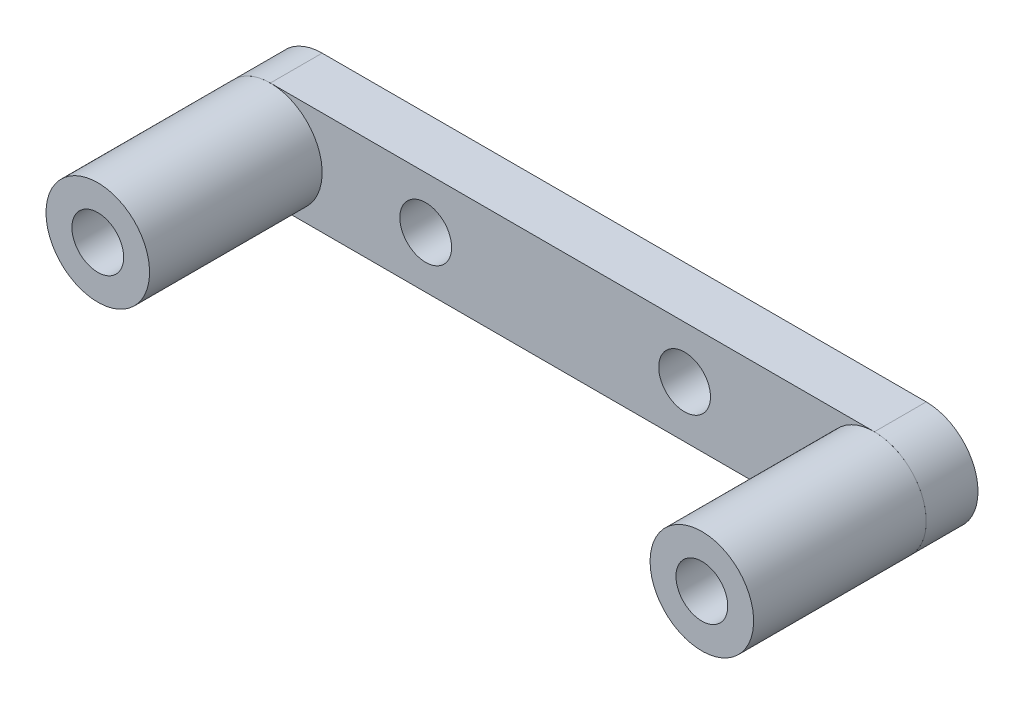
ISO-10303-21;
HEADER;
FILE_DESCRIPTION(('STEP AP214'),'2;1');
FILE_NAME('part.step','',(''),(''),'','','');
FILE_SCHEMA(('AUTOMOTIVE_DESIGN { 1 0 10303 214 1 1 1 1 }'));
ENDSEC;
DATA;
#1=APPLICATION_CONTEXT('core data for automotive mechanical design processes');
#2=APPLICATION_PROTOCOL_DEFINITION('international standard','automotive_design',2000,#1);
#3=PRODUCT_CONTEXT('',#1,'mechanical');
#4=PRODUCT('Part','Part','',(#3));
#5=PRODUCT_RELATED_PRODUCT_CATEGORY('part','',(#4));
#6=PRODUCT_DEFINITION_FORMATION('','',#4);
#7=PRODUCT_DEFINITION_CONTEXT('part definition',#1,'design');
#8=PRODUCT_DEFINITION('design','',#6,#7);
#9=PRODUCT_DEFINITION_SHAPE('','',#8);
#10=(LENGTH_UNIT() NAMED_UNIT(*) SI_UNIT(.MILLI.,.METRE.));
#11=(NAMED_UNIT(*) PLANE_ANGLE_UNIT() SI_UNIT($,.RADIAN.));
#12=(NAMED_UNIT(*) SI_UNIT($,.STERADIAN.) SOLID_ANGLE_UNIT());
#13=UNCERTAINTY_MEASURE_WITH_UNIT(LENGTH_MEASURE(1.E-05),#10,'distance_accuracy_value','');
#14=(GEOMETRIC_REPRESENTATION_CONTEXT(3) GLOBAL_UNCERTAINTY_ASSIGNED_CONTEXT((#13)) GLOBAL_UNIT_ASSIGNED_CONTEXT((#10,
#11,#12)) REPRESENTATION_CONTEXT('',''));
#15=CARTESIAN_POINT('',(0.,0.,0.));
#16=DIRECTION('',(0.,0.,1.));
#17=DIRECTION('',(1.,0.,0.));
#18=AXIS2_PLACEMENT_3D('',#15,#16,#17);
#19=CARTESIAN_POINT('',(18.5,0.,10.));
#20=DIRECTION('',(0.,0.,1.));
#21=DIRECTION('',(-1.,0.,0.));
#22=AXIS2_PLACEMENT_3D('',#19,#20,#21);
#23=PLANE('',#22);
#24=CARTESIAN_POINT('',(18.5,0.,10.));
#25=DIRECTION('',(0.,0.,-1.));
#26=DIRECTION('',(-1.,0.,0.));
#27=AXIS2_PLACEMENT_3D('',#24,#25,#26);
#28=CIRCLE('',#27,3.);
#29=CARTESIAN_POINT('',(15.5,0.,10.));
#30=VERTEX_POINT('',#29);
#31=EDGE_CURVE('E11',#30,#30,#28,.T.);
#32=ORIENTED_EDGE('',*,*,#31,.F.);
#33=EDGE_LOOP('',(#32));
#34=FACE_BOUND('',#33,.T.);
#35=CARTESIAN_POINT('',(18.5,0.,10.));
#36=DIRECTION('',(0.,0.,-1.));
#37=DIRECTION('',(-1.,0.,0.));
#38=AXIS2_PLACEMENT_3D('',#35,#36,#37);
#39=CIRCLE('',#38,1.5);
#40=CARTESIAN_POINT('',(17.,0.,10.));
#41=VERTEX_POINT('',#40);
#42=EDGE_CURVE('E53',#41,#41,#39,.T.);
#43=ORIENTED_EDGE('',*,*,#42,.T.);
#44=EDGE_LOOP('',(#43));
#45=FACE_BOUND('',#44,.T.);
#46=ADVANCED_FACE('F42',(#34,#45),#23,.T.);
#47=CARTESIAN_POINT('',(18.5,0.,0.));
#48=DIRECTION('',(0.,0.,1.));
#49=DIRECTION('',(-1.,0.,0.));
#50=AXIS2_PLACEMENT_3D('',#47,#48,#49);
#51=PLANE('',#50);
#52=CARTESIAN_POINT('',(18.5,0.,0.));
#53=DIRECTION('',(0.,0.,-1.));
#54=DIRECTION('',(-1.,0.,0.));
#55=AXIS2_PLACEMENT_3D('',#52,#53,#54);
#56=CIRCLE('',#55,3.);
#57=CARTESIAN_POINT('',(15.5,0.,0.));
#58=VERTEX_POINT('',#57);
#59=EDGE_CURVE('E46',#58,#58,#56,.T.);
#60=ORIENTED_EDGE('',*,*,#59,.T.);
#61=EDGE_LOOP('',(#60));
#62=FACE_BOUND('',#61,.T.);
#63=CARTESIAN_POINT('',(18.5,0.,0.));
#64=DIRECTION('',(0.,0.,-1.));
#65=DIRECTION('',(-1.,0.,0.));
#66=AXIS2_PLACEMENT_3D('',#63,#64,#65);
#67=CIRCLE('',#66,1.5);
#68=CARTESIAN_POINT('',(17.,0.,0.));
#69=VERTEX_POINT('',#68);
#70=EDGE_CURVE('E55',#69,#69,#67,.T.);
#71=ORIENTED_EDGE('',*,*,#70,.F.);
#72=EDGE_LOOP('',(#71));
#73=FACE_BOUND('',#72,.T.);
#74=ADVANCED_FACE('F68',(#62,#73),#51,.F.);
#75=CARTESIAN_POINT('',(18.5,0.,10.));
#76=DIRECTION('',(0.,0.,-1.));
#77=DIRECTION('',(1.,0.,0.));
#78=AXIS2_PLACEMENT_3D('',#75,#76,#77);
#79=CYLINDRICAL_SURFACE('',#78,3.);
#80=ORIENTED_EDGE('',*,*,#31,.T.);
#81=EDGE_LOOP('',(#80));
#82=FACE_BOUND('',#81,.T.);
#83=ORIENTED_EDGE('',*,*,#59,.F.);
#84=EDGE_LOOP('',(#83));
#85=FACE_BOUND('',#84,.T.);
#86=ADVANCED_FACE('F44',(#82,#85),#79,.T.);
#87=CARTESIAN_POINT('',(18.5,0.,10.));
#88=DIRECTION('',(0.,0.,-1.));
#89=DIRECTION('',(1.,0.,0.));
#90=AXIS2_PLACEMENT_3D('',#87,#88,#89);
#91=CYLINDRICAL_SURFACE('',#90,1.5);
#92=ORIENTED_EDGE('',*,*,#42,.F.);
#93=EDGE_LOOP('',(#92));
#94=FACE_BOUND('',#93,.T.);
#95=ORIENTED_EDGE('',*,*,#70,.T.);
#96=EDGE_LOOP('',(#95));
#97=FACE_BOUND('',#96,.T.);
#98=ADVANCED_FACE('F62',(#94,#97),#91,.F.);
#99=CLOSED_SHELL('',(#46,#74,#86,#98));
#100=MANIFOLD_SOLID_BREP('B2',#99);
#101=CARTESIAN_POINT('',(-16.5,0.,10.));
#102=DIRECTION('',(0.,0.,1.));
#103=DIRECTION('',(-1.,0.,0.));
#104=AXIS2_PLACEMENT_3D('',#101,#102,#103);
#105=PLANE('',#104);
#106=CARTESIAN_POINT('',(-16.5,0.,10.));
#107=DIRECTION('',(0.,0.,-1.));
#108=DIRECTION('',(-1.,0.,0.));
#109=AXIS2_PLACEMENT_3D('',#106,#107,#108);
#110=CIRCLE('',#109,2.99999999999999);
#111=CARTESIAN_POINT('',(-19.5,0.,10.));
#112=VERTEX_POINT('',#111);
#113=EDGE_CURVE('E41',#112,#112,#110,.T.);
#114=ORIENTED_EDGE('',*,*,#113,.F.);
#115=EDGE_LOOP('',(#114));
#116=FACE_BOUND('',#115,.T.);
#117=CARTESIAN_POINT('',(-16.5,0.,10.));
#118=DIRECTION('',(0.,0.,-1.));
#119=DIRECTION('',(-1.,0.,0.));
#120=AXIS2_PLACEMENT_3D('',#117,#118,#119);
#121=CIRCLE('',#120,1.5);
#122=CARTESIAN_POINT('',(-18.,0.,10.));
#123=VERTEX_POINT('',#122);
#124=EDGE_CURVE('E124',#123,#123,#121,.T.);
#125=ORIENTED_EDGE('',*,*,#124,.T.);
#126=EDGE_LOOP('',(#125));
#127=FACE_BOUND('',#126,.T.);
#128=ADVANCED_FACE('F113',(#116,#127),#105,.T.);
#129=CARTESIAN_POINT('',(-16.5,0.,0.));
#130=DIRECTION('',(0.,0.,1.));
#131=DIRECTION('',(-1.,0.,0.));
#132=AXIS2_PLACEMENT_3D('',#129,#130,#131);
#133=PLANE('',#132);
#134=CARTESIAN_POINT('',(-16.5,0.,0.));
#135=DIRECTION('',(0.,0.,-1.));
#136=DIRECTION('',(-1.,0.,0.));
#137=AXIS2_PLACEMENT_3D('',#134,#135,#136);
#138=CIRCLE('',#137,2.99999999999999);
#139=CARTESIAN_POINT('',(-19.5,0.,0.));
#140=VERTEX_POINT('',#139);
#141=EDGE_CURVE('E117',#140,#140,#138,.T.);
#142=ORIENTED_EDGE('',*,*,#141,.T.);
#143=EDGE_LOOP('',(#142));
#144=FACE_BOUND('',#143,.T.);
#145=CARTESIAN_POINT('',(-16.5,0.,0.));
#146=DIRECTION('',(0.,0.,-1.));
#147=DIRECTION('',(-1.,0.,0.));
#148=AXIS2_PLACEMENT_3D('',#145,#146,#147);
#149=CIRCLE('',#148,1.5);
#150=CARTESIAN_POINT('',(-18.,0.,0.));
#151=VERTEX_POINT('',#150);
#152=EDGE_CURVE('E126',#151,#151,#149,.T.);
#153=ORIENTED_EDGE('',*,*,#152,.F.);
#154=EDGE_LOOP('',(#153));
#155=FACE_BOUND('',#154,.T.);
#156=ADVANCED_FACE('F139',(#144,#155),#133,.F.);
#157=CARTESIAN_POINT('',(-16.5,0.,10.));
#158=DIRECTION('',(0.,0.,-1.));
#159=DIRECTION('',(1.,0.,0.));
#160=AXIS2_PLACEMENT_3D('',#157,#158,#159);
#161=CYLINDRICAL_SURFACE('',#160,2.99999999999999);
#162=ORIENTED_EDGE('',*,*,#113,.T.);
#163=EDGE_LOOP('',(#162));
#164=FACE_BOUND('',#163,.T.);
#165=ORIENTED_EDGE('',*,*,#141,.F.);
#166=EDGE_LOOP('',(#165));
#167=FACE_BOUND('',#166,.T.);
#168=ADVANCED_FACE('F115',(#164,#167),#161,.T.);
#169=CARTESIAN_POINT('',(-16.5,0.,10.));
#170=DIRECTION('',(0.,0.,-1.));
#171=DIRECTION('',(1.,0.,0.));
#172=AXIS2_PLACEMENT_3D('',#169,#170,#171);
#173=CYLINDRICAL_SURFACE('',#172,1.5);
#174=ORIENTED_EDGE('',*,*,#124,.F.);
#175=EDGE_LOOP('',(#174));
#176=FACE_BOUND('',#175,.T.);
#177=ORIENTED_EDGE('',*,*,#152,.T.);
#178=EDGE_LOOP('',(#177));
#179=FACE_BOUND('',#178,.T.);
#180=ADVANCED_FACE('F133',(#176,#179),#173,.F.);
#181=CLOSED_SHELL('',(#128,#156,#168,#180));
#182=MANIFOLD_SOLID_BREP('B6',#181);
#183=CARTESIAN_POINT('',(-7.5,0.,-3.));
#184=DIRECTION('',(0.,0.,-1.));
#185=DIRECTION('',(1.,0.,0.));
#186=AXIS2_PLACEMENT_3D('',#183,#184,#185);
#187=PLANE('',#186);
#188=CARTESIAN_POINT('',(-7.5,0.,-3.));
#189=DIRECTION('',(0.,0.,1.));
#190=DIRECTION('',(1.,0.,0.));
#191=AXIS2_PLACEMENT_3D('',#188,#189,#190);
#192=CIRCLE('',#191,1.5);
#193=CARTESIAN_POINT('',(-6.,0.,-3.));
#194=VERTEX_POINT('',#193);
#195=EDGE_CURVE('E265',#194,#194,#192,.T.);
#196=ORIENTED_EDGE('',*,*,#195,.T.);
#197=EDGE_LOOP('',(#196));
#198=FACE_BOUND('',#197,.T.);
#199=DIRECTION('',(-1.,0.,0.));
#200=VECTOR('',#199,1.);
#201=CARTESIAN_POINT('',(-7.5,3.,-3.));
#202=LINE('',#201,#200);
#203=CARTESIAN_POINT('',(18.5,3.,-3.));
#204=VERTEX_POINT('',#203);
#205=CARTESIAN_POINT('',(-16.5,3.,-3.));
#206=VERTEX_POINT('',#205);
#207=EDGE_CURVE('E111',#204,#206,#202,.T.);
#208=ORIENTED_EDGE('',*,*,#207,.F.);
#209=CARTESIAN_POINT('',(18.5,0.,-3.));
#210=DIRECTION('',(0.,0.,1.));
#211=DIRECTION('',(-1.,0.,0.));
#212=AXIS2_PLACEMENT_3D('',#209,#210,#211);
#213=CIRCLE('',#212,3.);
#214=CARTESIAN_POINT('',(18.5,-3.,-3.));
#215=VERTEX_POINT('',#214);
#216=EDGE_CURVE('E222',#215,#204,#213,.T.);
#217=ORIENTED_EDGE('',*,*,#216,.F.);
#218=DIRECTION('',(1.,0.,0.));
#219=VECTOR('',#218,1.);
#220=CARTESIAN_POINT('',(-7.5,-3.,-3.));
#221=LINE('',#220,#219);
#222=CARTESIAN_POINT('',(-16.5,-3.,-3.));
#223=VERTEX_POINT('',#222);
#224=EDGE_CURVE('E184',#223,#215,#221,.T.);
#225=ORIENTED_EDGE('',*,*,#224,.F.);
#226=CARTESIAN_POINT('',(-16.5,0.,-3.));
#227=DIRECTION('',(0.,0.,1.));
#228=DIRECTION('',(1.,0.,0.));
#229=AXIS2_PLACEMENT_3D('',#226,#227,#228);
#230=CIRCLE('',#229,3.);
#231=EDGE_CURVE('E252',#206,#223,#230,.T.);
#232=ORIENTED_EDGE('',*,*,#231,.F.);
#233=EDGE_LOOP('',(#208,#217,#225,#232));
#234=FACE_BOUND('',#233,.T.);
#235=CARTESIAN_POINT('',(7.5,0.,-3.));
#236=DIRECTION('',(0.,0.,1.));
#237=DIRECTION('',(1.,0.,0.));
#238=AXIS2_PLACEMENT_3D('',#235,#236,#237);
#239=CIRCLE('',#238,1.5);
#240=CARTESIAN_POINT('',(9.,0.,-3.));
#241=VERTEX_POINT('',#240);
#242=EDGE_CURVE('E259',#241,#241,#239,.T.);
#243=ORIENTED_EDGE('',*,*,#242,.T.);
#244=EDGE_LOOP('',(#243));
#245=FACE_BOUND('',#244,.T.);
#246=CARTESIAN_POINT('',(-16.5,0.,-3.));
#247=DIRECTION('',(0.,0.,1.));
#248=DIRECTION('',(1.,0.,0.));
#249=AXIS2_PLACEMENT_3D('',#246,#247,#248);
#250=CIRCLE('',#249,1.5);
#251=CARTESIAN_POINT('',(-15.,0.,-3.));
#252=VERTEX_POINT('',#251);
#253=EDGE_CURVE('E246',#252,#252,#250,.T.);
#254=ORIENTED_EDGE('',*,*,#253,.T.);
#255=EDGE_LOOP('',(#254));
#256=FACE_BOUND('',#255,.T.);
#257=CARTESIAN_POINT('',(18.5,0.,-3.));
#258=DIRECTION('',(0.,0.,1.));
#259=DIRECTION('',(1.,0.,0.));
#260=AXIS2_PLACEMENT_3D('',#257,#258,#259);
#261=CIRCLE('',#260,1.5);
#262=CARTESIAN_POINT('',(20.,0.,-3.));
#263=VERTEX_POINT('',#262);
#264=EDGE_CURVE('E236',#263,#263,#261,.T.);
#265=ORIENTED_EDGE('',*,*,#264,.T.);
#266=EDGE_LOOP('',(#265));
#267=FACE_BOUND('',#266,.T.);
#268=ADVANCED_FACE('F175',(#198,#234,#245,#256,#267),#187,.T.);
#269=CARTESIAN_POINT('',(-7.5,0.,0.));
#270=DIRECTION('',(0.,0.,-1.));
#271=DIRECTION('',(1.,0.,0.));
#272=AXIS2_PLACEMENT_3D('',#269,#270,#271);
#273=PLANE('',#272);
#274=DIRECTION('',(1.,0.,0.));
#275=VECTOR('',#274,1.);
#276=CARTESIAN_POINT('',(-7.5,-3.,0.));
#277=LINE('',#276,#275);
#278=CARTESIAN_POINT('',(-16.5,-3.,0.));
#279=VERTEX_POINT('',#278);
#280=CARTESIAN_POINT('',(18.5,-3.,0.));
#281=VERTEX_POINT('',#280);
#282=EDGE_CURVE('E268',#279,#281,#277,.T.);
#283=ORIENTED_EDGE('',*,*,#282,.T.);
#284=CARTESIAN_POINT('',(18.5,0.,0.));
#285=DIRECTION('',(0.,0.,1.));
#286=DIRECTION('',(1.,0.,0.));
#287=AXIS2_PLACEMENT_3D('',#284,#285,#286);
#288=CIRCLE('',#287,3.);
#289=CARTESIAN_POINT('',(18.5,3.,0.));
#290=VERTEX_POINT('',#289);
#291=EDGE_CURVE('E225',#290,#281,#288,.F.);
#292=ORIENTED_EDGE('',*,*,#291,.F.);
#293=DIRECTION('',(-1.,0.,0.));
#294=VECTOR('',#293,1.);
#295=CARTESIAN_POINT('',(-7.5,3.,0.));
#296=LINE('',#295,#294);
#297=CARTESIAN_POINT('',(-16.5,3.,0.));
#298=VERTEX_POINT('',#297);
#299=EDGE_CURVE('E179',#290,#298,#296,.T.);
#300=ORIENTED_EDGE('',*,*,#299,.T.);
#301=CARTESIAN_POINT('',(-16.5,0.,0.));
#302=DIRECTION('',(0.,0.,1.));
#303=DIRECTION('',(1.,0.,0.));
#304=AXIS2_PLACEMENT_3D('',#301,#302,#303);
#305=CIRCLE('',#304,3.);
#306=EDGE_CURVE('E247',#279,#298,#305,.F.);
#307=ORIENTED_EDGE('',*,*,#306,.F.);
#308=EDGE_LOOP('',(#283,#292,#300,#307));
#309=FACE_BOUND('',#308,.T.);
#310=CARTESIAN_POINT('',(-7.5,0.,0.));
#311=DIRECTION('',(0.,0.,1.));
#312=DIRECTION('',(1.,0.,0.));
#313=AXIS2_PLACEMENT_3D('',#310,#311,#312);
#314=CIRCLE('',#313,1.5);
#315=CARTESIAN_POINT('',(-6.,0.,0.));
#316=VERTEX_POINT('',#315);
#317=EDGE_CURVE('E262',#316,#316,#314,.T.);
#318=ORIENTED_EDGE('',*,*,#317,.F.);
#319=EDGE_LOOP('',(#318));
#320=FACE_BOUND('',#319,.T.);
#321=CARTESIAN_POINT('',(7.5,0.,0.));
#322=DIRECTION('',(0.,0.,1.));
#323=DIRECTION('',(1.,0.,0.));
#324=AXIS2_PLACEMENT_3D('',#321,#322,#323);
#325=CIRCLE('',#324,1.5);
#326=CARTESIAN_POINT('',(9.,0.,0.));
#327=VERTEX_POINT('',#326);
#328=EDGE_CURVE('E258',#327,#327,#325,.T.);
#329=ORIENTED_EDGE('',*,*,#328,.F.);
#330=EDGE_LOOP('',(#329));
#331=FACE_BOUND('',#330,.T.);
#332=CARTESIAN_POINT('',(-16.5,0.,0.));
#333=DIRECTION('',(0.,0.,1.));
#334=DIRECTION('',(1.,0.,0.));
#335=AXIS2_PLACEMENT_3D('',#332,#333,#334);
#336=CIRCLE('',#335,1.5);
#337=CARTESIAN_POINT('',(-15.,0.,0.));
#338=VERTEX_POINT('',#337);
#339=EDGE_CURVE('E249',#338,#338,#336,.F.);
#340=ORIENTED_EDGE('',*,*,#339,.T.);
#341=EDGE_LOOP('',(#340));
#342=FACE_BOUND('',#341,.T.);
#343=CARTESIAN_POINT('',(18.5,0.,0.));
#344=DIRECTION('',(0.,0.,1.));
#345=DIRECTION('',(1.,0.,0.));
#346=AXIS2_PLACEMENT_3D('',#343,#344,#345);
#347=CIRCLE('',#346,1.5);
#348=CARTESIAN_POINT('',(20.,0.,0.));
#349=VERTEX_POINT('',#348);
#350=EDGE_CURVE('E243',#349,#349,#347,.F.);
#351=ORIENTED_EDGE('',*,*,#350,.T.);
#352=EDGE_LOOP('',(#351));
#353=FACE_BOUND('',#352,.T.);
#354=ADVANCED_FACE('F272',(#309,#320,#331,#342,#353),#273,.F.);
#355=CARTESIAN_POINT('',(-7.5,-3.,-3.));
#356=DIRECTION('',(0.,1.,0.));
#357=DIRECTION('',(-1.,0.,0.));
#358=AXIS2_PLACEMENT_3D('',#355,#356,#357);
#359=PLANE('',#358);
#360=ORIENTED_EDGE('',*,*,#282,.F.);
#361=DIRECTION('',(0.,0.,-1.));
#362=VECTOR('',#361,1.);
#363=CARTESIAN_POINT('',(-16.5,-3.,15.2315462117278));
#364=LINE('',#363,#362);
#365=EDGE_CURVE('E192',#279,#223,#364,.T.);
#366=ORIENTED_EDGE('',*,*,#365,.T.);
#367=ORIENTED_EDGE('',*,*,#224,.T.);
#368=DIRECTION('',(0.,0.,-1.));
#369=VECTOR('',#368,1.);
#370=CARTESIAN_POINT('',(18.5,-3.,15.2315462117278));
#371=LINE('',#370,#369);
#372=EDGE_CURVE('E218',#281,#215,#371,.T.);
#373=ORIENTED_EDGE('',*,*,#372,.F.);
#374=EDGE_LOOP('',(#360,#366,#367,#373));
#375=FACE_BOUND('',#374,.T.);
#376=ADVANCED_FACE('F177',(#375),#359,.F.);
#377=CARTESIAN_POINT('',(-7.5,3.,-3.));
#378=DIRECTION('',(0.,-1.,0.));
#379=DIRECTION('',(1.,0.,0.));
#380=AXIS2_PLACEMENT_3D('',#377,#378,#379);
#381=PLANE('',#380);
#382=ORIENTED_EDGE('',*,*,#299,.F.);
#383=DIRECTION('',(0.,0.,-1.));
#384=VECTOR('',#383,1.);
#385=CARTESIAN_POINT('',(18.5,3.,15.2315462117278));
#386=LINE('',#385,#384);
#387=EDGE_CURVE('E229',#290,#204,#386,.T.);
#388=ORIENTED_EDGE('',*,*,#387,.T.);
#389=ORIENTED_EDGE('',*,*,#207,.T.);
#390=DIRECTION('',(0.,0.,-1.));
#391=VECTOR('',#390,1.);
#392=CARTESIAN_POINT('',(-16.5,3.,15.2315462117278));
#393=LINE('',#392,#391);
#394=EDGE_CURVE('E199',#298,#206,#393,.T.);
#395=ORIENTED_EDGE('',*,*,#394,.F.);
#396=EDGE_LOOP('',(#382,#388,#389,#395));
#397=FACE_BOUND('',#396,.T.);
#398=ADVANCED_FACE('F274',(#397),#381,.F.);
#399=CARTESIAN_POINT('',(-7.5,0.,-3.));
#400=DIRECTION('',(0.,0.,1.));
#401=DIRECTION('',(-1.,0.,0.));
#402=AXIS2_PLACEMENT_3D('',#399,#400,#401);
#403=CYLINDRICAL_SURFACE('',#402,1.5);
#404=ORIENTED_EDGE('',*,*,#195,.F.);
#405=EDGE_LOOP('',(#404));
#406=FACE_BOUND('',#405,.T.);
#407=ORIENTED_EDGE('',*,*,#317,.T.);
#408=EDGE_LOOP('',(#407));
#409=FACE_BOUND('',#408,.T.);
#410=ADVANCED_FACE('F276',(#406,#409),#403,.F.);
#411=CARTESIAN_POINT('',(7.5,0.,-3.));
#412=DIRECTION('',(0.,0.,1.));
#413=DIRECTION('',(-1.,0.,0.));
#414=AXIS2_PLACEMENT_3D('',#411,#412,#413);
#415=CYLINDRICAL_SURFACE('',#414,1.5);
#416=ORIENTED_EDGE('',*,*,#242,.F.);
#417=EDGE_LOOP('',(#416));
#418=FACE_BOUND('',#417,.T.);
#419=ORIENTED_EDGE('',*,*,#328,.T.);
#420=EDGE_LOOP('',(#419));
#421=FACE_BOUND('',#420,.T.);
#422=ADVANCED_FACE('F281',(#418,#421),#415,.F.);
#423=CARTESIAN_POINT('',(-16.5,0.,15.2315462117278));
#424=DIRECTION('',(0.,0.,-1.));
#425=DIRECTION('',(1.,0.,0.));
#426=AXIS2_PLACEMENT_3D('',#423,#424,#425);
#427=CYLINDRICAL_SURFACE('',#426,3.);
#428=ORIENTED_EDGE('',*,*,#306,.T.);
#429=ORIENTED_EDGE('',*,*,#394,.T.);
#430=ORIENTED_EDGE('',*,*,#231,.T.);
#431=ORIENTED_EDGE('',*,*,#365,.F.);
#432=EDGE_LOOP('',(#428,#429,#430,#431));
#433=FACE_BOUND('',#432,.T.);
#434=ADVANCED_FACE('F294',(#433),#427,.T.);
#435=CARTESIAN_POINT('',(-16.5,0.,15.2315462117278));
#436=DIRECTION('',(0.,0.,-1.));
#437=DIRECTION('',(1.,0.,0.));
#438=AXIS2_PLACEMENT_3D('',#435,#436,#437);
#439=CYLINDRICAL_SURFACE('',#438,1.5);
#440=ORIENTED_EDGE('',*,*,#339,.F.);
#441=EDGE_LOOP('',(#440));
#442=FACE_BOUND('',#441,.T.);
#443=ORIENTED_EDGE('',*,*,#253,.F.);
#444=EDGE_LOOP('',(#443));
#445=FACE_BOUND('',#444,.T.);
#446=ADVANCED_FACE('F298',(#442,#445),#439,.F.);
#447=CARTESIAN_POINT('',(18.5,0.,15.2315462117278));
#448=DIRECTION('',(0.,0.,-1.));
#449=DIRECTION('',(1.,0.,0.));
#450=AXIS2_PLACEMENT_3D('',#447,#448,#449);
#451=CYLINDRICAL_SURFACE('',#450,3.);
#452=ORIENTED_EDGE('',*,*,#291,.T.);
#453=ORIENTED_EDGE('',*,*,#372,.T.);
#454=ORIENTED_EDGE('',*,*,#216,.T.);
#455=ORIENTED_EDGE('',*,*,#387,.F.);
#456=EDGE_LOOP('',(#452,#453,#454,#455));
#457=FACE_BOUND('',#456,.T.);
#458=ADVANCED_FACE('F220',(#457),#451,.T.);
#459=CARTESIAN_POINT('',(18.5,0.,15.2315462117278));
#460=DIRECTION('',(0.,0.,-1.));
#461=DIRECTION('',(1.,0.,0.));
#462=AXIS2_PLACEMENT_3D('',#459,#460,#461);
#463=CYLINDRICAL_SURFACE('',#462,1.5);
#464=ORIENTED_EDGE('',*,*,#350,.F.);
#465=EDGE_LOOP('',(#464));
#466=FACE_BOUND('',#465,.T.);
#467=ORIENTED_EDGE('',*,*,#264,.F.);
#468=EDGE_LOOP('',(#467));
#469=FACE_BOUND('',#468,.T.);
#470=ADVANCED_FACE('F304',(#466,#469),#463,.F.);
#471=CLOSED_SHELL('',(#268,#354,#376,#398,#410,#422,#434,#446,#458,#470));
#472=MANIFOLD_SOLID_BREP('B36',#471);
#473=ADVANCED_BREP_SHAPE_REPRESENTATION('',(#18,#100,#182,#472),#14);
#474=SHAPE_DEFINITION_REPRESENTATION(#9,#473);
ENDSEC;
END-ISO-10303-21;
